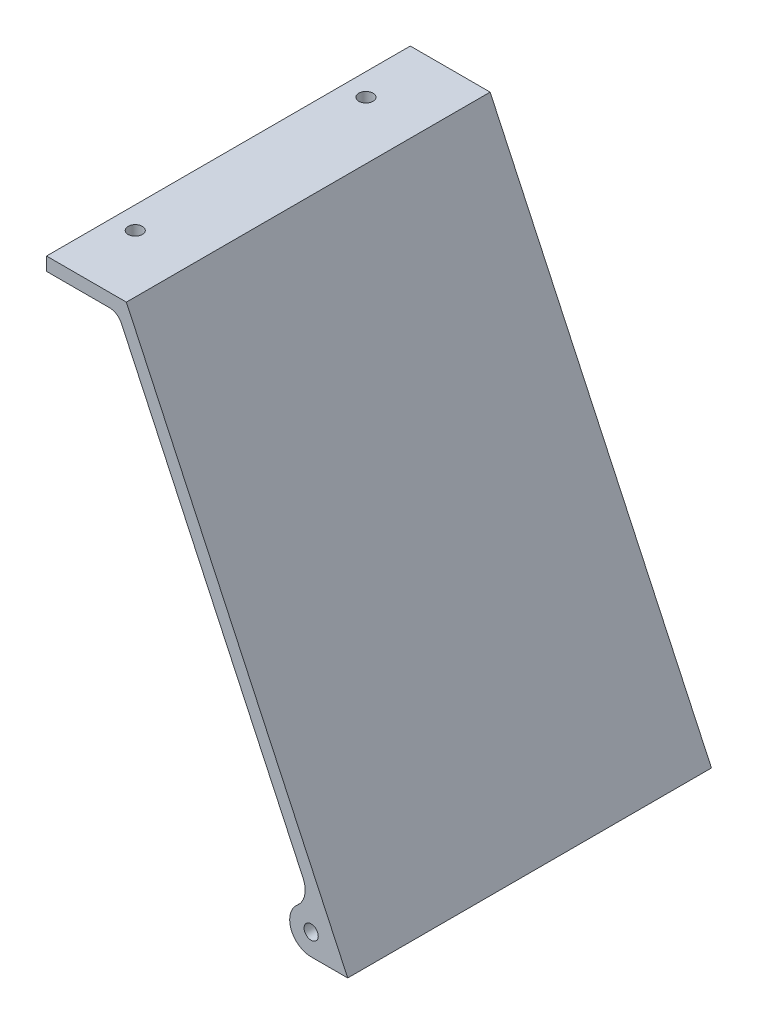
ISO-10303-21;
HEADER;
FILE_DESCRIPTION(('STEP AP214'),'2;1');
FILE_NAME('part.step','',(''),(''),'','','');
FILE_SCHEMA(('AUTOMOTIVE_DESIGN { 1 0 10303 214 1 1 1 1 }'));
ENDSEC;
DATA;
#1=APPLICATION_CONTEXT('core data for automotive mechanical design processes');
#2=APPLICATION_PROTOCOL_DEFINITION('international standard','automotive_design',2000,#1);
#3=PRODUCT_CONTEXT('',#1,'mechanical');
#4=PRODUCT('Part','Part','',(#3));
#5=PRODUCT_RELATED_PRODUCT_CATEGORY('part','',(#4));
#6=PRODUCT_DEFINITION_FORMATION('','',#4);
#7=PRODUCT_DEFINITION_CONTEXT('part definition',#1,'design');
#8=PRODUCT_DEFINITION('design','',#6,#7);
#9=PRODUCT_DEFINITION_SHAPE('','',#8);
#10=(LENGTH_UNIT() NAMED_UNIT(*) SI_UNIT(.MILLI.,.METRE.));
#11=(NAMED_UNIT(*) PLANE_ANGLE_UNIT() SI_UNIT($,.RADIAN.));
#12=(NAMED_UNIT(*) SI_UNIT($,.STERADIAN.) SOLID_ANGLE_UNIT());
#13=UNCERTAINTY_MEASURE_WITH_UNIT(LENGTH_MEASURE(1.E-05),#10,'distance_accuracy_value','');
#14=(GEOMETRIC_REPRESENTATION_CONTEXT(3) GLOBAL_UNCERTAINTY_ASSIGNED_CONTEXT((#13)) GLOBAL_UNIT_ASSIGNED_CONTEXT((#10,
#11,#12)) REPRESENTATION_CONTEXT('',''));
#15=CARTESIAN_POINT('',(0.,0.,0.));
#16=DIRECTION('',(0.,0.,1.));
#17=DIRECTION('',(1.,0.,0.));
#18=AXIS2_PLACEMENT_3D('',#15,#16,#17);
#19=CARTESIAN_POINT('',(25.7263298512666,-61.5435669274197,82.));
#20=DIRECTION('',(0.90630778703665,0.422618261740698,0.));
#21=DIRECTION('',(-0.422618261740698,0.906307787036651,0.));
#22=AXIS2_PLACEMENT_3D('',#19,#20,#21);
#23=PLANE('',#22);
#24=DIRECTION('',(0.422618261740698,-0.906307787036651,0.));
#25=VECTOR('',#24,1.);
#26=CARTESIAN_POINT('',(23.7563844825598,-57.3190054512023,5.));
#27=LINE('',#26,#25);
#28=CARTESIAN_POINT('',(23.7563844825598,-57.3190054512023,5.));
#29=VERTEX_POINT('',#28);
#30=CARTESIAN_POINT('',(30.5075500442898,-71.7969267198381,5.));
#31=VERTEX_POINT('',#30);
#32=EDGE_CURVE('E142',#29,#31,#27,.T.);
#33=ORIENTED_EDGE('',*,*,#32,.T.);
#34=DIRECTION('',(0.,0.,1.));
#35=VECTOR('',#34,1.);
#36=CARTESIAN_POINT('',(30.5075500442898,-71.7969267198381,0.));
#37=LINE('',#36,#35);
#38=CARTESIAN_POINT('',(30.5075500442898,-71.7969267198381,77.));
#39=VERTEX_POINT('',#38);
#40=EDGE_CURVE('E131',#31,#39,#37,.T.);
#41=ORIENTED_EDGE('',*,*,#40,.T.);
#42=DIRECTION('',(-0.422618261740698,0.906307787036651,0.));
#43=VECTOR('',#42,1.);
#44=CARTESIAN_POINT('',(23.7563844825598,-57.3190054512023,77.));
#45=LINE('',#44,#43);
#46=CARTESIAN_POINT('',(23.7563844825598,-57.3190054512023,77.));
#47=VERTEX_POINT('',#46);
#48=EDGE_CURVE('E237',#39,#47,#45,.T.);
#49=ORIENTED_EDGE('',*,*,#48,.T.);
#50=DIRECTION('',(0.,0.,1.));
#51=VECTOR('',#50,1.);
#52=CARTESIAN_POINT('',(23.7563844825598,-57.3190054512023,77.));
#53=LINE('',#52,#51);
#54=CARTESIAN_POINT('',(23.7563844825598,-57.3190054512023,82.));
#55=VERTEX_POINT('',#54);
#56=EDGE_CURVE('E236',#47,#55,#53,.T.);
#57=ORIENTED_EDGE('',*,*,#56,.T.);
#58=DIRECTION('',(0.422618261740698,-0.906307787036651,0.));
#59=VECTOR('',#58,1.);
#60=CARTESIAN_POINT('',(-17.9884464038298,32.2030732801619,82.));
#61=LINE('',#60,#59);
#62=CARTESIAN_POINT('',(-17.1807338251423,30.470928065384,82.));
#63=VERTEX_POINT('',#62);
#64=EDGE_CURVE('E185',#63,#55,#61,.T.);
#65=ORIENTED_EDGE('',*,*,#64,.F.);
#66=DIRECTION('',(0.,0.,-1.));
#67=VECTOR('',#66,1.);
#68=CARTESIAN_POINT('',(-17.1807338251424,30.470928065384,0.));
#69=LINE('',#68,#67);
#70=CARTESIAN_POINT('',(-17.1807338251424,30.470928065384,0.));
#71=VERTEX_POINT('',#70);
#72=EDGE_CURVE('E211',#63,#71,#69,.T.);
#73=ORIENTED_EDGE('',*,*,#72,.T.);
#74=DIRECTION('',(0.422618261740698,-0.906307787036651,0.));
#75=VECTOR('',#74,1.);
#76=CARTESIAN_POINT('',(25.7263298512666,-61.5435669274197,0.));
#77=LINE('',#76,#75);
#78=CARTESIAN_POINT('',(23.7563844825598,-57.3190054512023,0.));
#79=VERTEX_POINT('',#78);
#80=EDGE_CURVE('E57',#71,#79,#77,.T.);
#81=ORIENTED_EDGE('',*,*,#80,.T.);
#82=DIRECTION('',(0.,0.,-1.));
#83=VECTOR('',#82,1.);
#84=CARTESIAN_POINT('',(23.7563844825598,-57.3190054512023,5.));
#85=LINE('',#84,#83);
#86=EDGE_CURVE('E52',#29,#79,#85,.T.);
#87=ORIENTED_EDGE('',*,*,#86,.F.);
#88=EDGE_LOOP('',(#33,#41,#49,#57,#65,#73,#81,#87));
#89=FACE_BOUND('',#88,.T.);
#90=ADVANCED_FACE('F37',(#89),#23,.F.);
#91=CARTESIAN_POINT('',(-34.0772356214073,35.2030732801618,82.));
#92=DIRECTION('',(1.,0.,0.));
#93=DIRECTION('',(0.,0.,-1.));
#94=AXIS2_PLACEMENT_3D('',#91,#92,#93);
#95=PLANE('',#94);
#96=DIRECTION('',(0.,-1.,0.));
#97=VECTOR('',#96,1.);
#98=CARTESIAN_POINT('',(-34.0772356214073,35.2030732801618,0.));
#99=LINE('',#98,#97);
#100=CARTESIAN_POINT('',(-34.0772356214073,35.2030732801618,0.));
#101=VERTEX_POINT('',#100);
#102=CARTESIAN_POINT('',(-34.0772356214073,32.2030732801619,0.));
#103=VERTEX_POINT('',#102);
#104=EDGE_CURVE('E193',#101,#103,#99,.T.);
#105=ORIENTED_EDGE('',*,*,#104,.T.);
#106=DIRECTION('',(0.,0.,-1.));
#107=VECTOR('',#106,1.);
#108=CARTESIAN_POINT('',(-34.0772356214073,32.2030732801619,82.));
#109=LINE('',#108,#107);
#110=CARTESIAN_POINT('',(-34.0772356214073,32.2030732801619,82.));
#111=VERTEX_POINT('',#110);
#112=EDGE_CURVE('E208',#111,#103,#109,.T.);
#113=ORIENTED_EDGE('',*,*,#112,.F.);
#114=DIRECTION('',(0.,-1.,0.));
#115=VECTOR('',#114,1.);
#116=CARTESIAN_POINT('',(-34.0772356214073,35.2030732801618,82.));
#117=LINE('',#116,#115);
#118=CARTESIAN_POINT('',(-34.0772356214073,35.2030732801618,82.));
#119=VERTEX_POINT('',#118);
#120=EDGE_CURVE('E178',#119,#111,#117,.T.);
#121=ORIENTED_EDGE('',*,*,#120,.F.);
#122=DIRECTION('',(0.,0.,-1.));
#123=VECTOR('',#122,1.);
#124=CARTESIAN_POINT('',(-34.0772356214073,35.2030732801618,82.));
#125=LINE('',#124,#123);
#126=EDGE_CURVE('E192',#119,#101,#125,.T.);
#127=ORIENTED_EDGE('',*,*,#126,.T.);
#128=EDGE_LOOP('',(#105,#113,#121,#127));
#129=FACE_BOUND('',#128,.T.);
#130=ADVANCED_FACE('F310',(#129),#95,.F.);
#131=CARTESIAN_POINT('',(-34.0772356214073,32.2030732801619,82.));
#132=DIRECTION('',(0.,1.,0.));
#133=DIRECTION('',(0.,0.,1.));
#134=AXIS2_PLACEMENT_3D('',#131,#132,#133);
#135=PLANE('',#134);
#136=CARTESIAN_POINT('',(-29.0772356214073,32.2030732801619,15.));
#137=DIRECTION('',(0.,-1.,0.));
#138=DIRECTION('',(0.,0.,1.));
#139=AXIS2_PLACEMENT_3D('',#136,#137,#138);
#140=CIRCLE('',#139,1.6);
#141=CARTESIAN_POINT('',(-29.0772356214073,32.2030732801619,16.6));
#142=VERTEX_POINT('',#141);
#143=EDGE_CURVE('E167',#142,#142,#140,.T.);
#144=ORIENTED_EDGE('',*,*,#143,.F.);
#145=EDGE_LOOP('',(#144));
#146=FACE_BOUND('',#145,.T.);
#147=CARTESIAN_POINT('',(-29.0772356214073,32.2030732801619,67.));
#148=DIRECTION('',(0.,-1.,0.));
#149=DIRECTION('',(0.,0.,-1.));
#150=AXIS2_PLACEMENT_3D('',#147,#148,#149);
#151=CIRCLE('',#150,1.60000000000001);
#152=CARTESIAN_POINT('',(-29.0772356214073,32.2030732801619,65.4));
#153=VERTEX_POINT('',#152);
#154=EDGE_CURVE('E174',#153,#153,#151,.T.);
#155=ORIENTED_EDGE('',*,*,#154,.F.);
#156=EDGE_LOOP('',(#155));
#157=FACE_BOUND('',#156,.T.);
#158=DIRECTION('',(1.,0.,0.));
#159=VECTOR('',#158,1.);
#160=CARTESIAN_POINT('',(-34.0772356214073,32.2030732801619,0.));
#161=LINE('',#160,#159);
#162=CARTESIAN_POINT('',(-19.8996571862523,32.2030732801619,0.));
#163=VERTEX_POINT('',#162);
#164=EDGE_CURVE('E196',#103,#163,#161,.T.);
#165=ORIENTED_EDGE('',*,*,#164,.T.);
#166=DIRECTION('',(0.,0.,-1.));
#167=VECTOR('',#166,1.);
#168=CARTESIAN_POINT('',(-19.8996571862523,32.2030732801619,82.));
#169=LINE('',#168,#167);
#170=CARTESIAN_POINT('',(-19.8996571862523,32.2030732801619,82.));
#171=VERTEX_POINT('',#170);
#172=EDGE_CURVE('E217',#163,#171,#169,.F.);
#173=ORIENTED_EDGE('',*,*,#172,.T.);
#174=DIRECTION('',(1.,0.,0.));
#175=VECTOR('',#174,1.);
#176=CARTESIAN_POINT('',(-34.0772356214073,32.2030732801619,82.));
#177=LINE('',#176,#175);
#178=EDGE_CURVE('E181',#111,#171,#177,.T.);
#179=ORIENTED_EDGE('',*,*,#178,.F.);
#180=ORIENTED_EDGE('',*,*,#112,.T.);
#181=EDGE_LOOP('',(#165,#173,#179,#180));
#182=FACE_BOUND('',#181,.T.);
#183=ADVANCED_FACE('F227',(#146,#157,#182),#135,.F.);
#184=CARTESIAN_POINT('',(-16.0772356214073,35.2030732801618,82.));
#185=DIRECTION('',(-0.906307787036651,-0.422618261740698,0.));
#186=DIRECTION('',(0.422618261740698,-0.906307787036651,0.));
#187=AXIS2_PLACEMENT_3D('',#184,#185,#186);
#188=PLANE('',#187);
#189=DIRECTION('',(-0.422618261740698,0.906307787036651,0.));
#190=VECTOR('',#189,1.);
#191=CARTESIAN_POINT('',(-16.0772356214073,35.2030732801618,82.));
#192=LINE('',#191,#190);
#193=CARTESIAN_POINT('',(33.8176838011773,-71.7969267198381,82.));
#194=VERTEX_POINT('',#193);
#195=CARTESIAN_POINT('',(-16.0772356214073,35.2030732801618,82.));
#196=VERTEX_POINT('',#195);
#197=EDGE_CURVE('E188',#194,#196,#192,.T.);
#198=ORIENTED_EDGE('',*,*,#197,.F.);
#199=DIRECTION('',(0.,0.,-1.));
#200=VECTOR('',#199,1.);
#201=CARTESIAN_POINT('',(33.8176838011773,-71.7969267198381,82.));
#202=LINE('',#201,#200);
#203=CARTESIAN_POINT('',(33.8176838011773,-71.7969267198381,0.));
#204=VERTEX_POINT('',#203);
#205=EDGE_CURVE('E140',#194,#204,#202,.T.);
#206=ORIENTED_EDGE('',*,*,#205,.T.);
#207=DIRECTION('',(-0.422618261740698,0.906307787036651,0.));
#208=VECTOR('',#207,1.);
#209=CARTESIAN_POINT('',(-16.0772356214073,35.2030732801618,0.));
#210=LINE('',#209,#208);
#211=CARTESIAN_POINT('',(-16.0772356214073,35.2030732801618,0.));
#212=VERTEX_POINT('',#211);
#213=EDGE_CURVE('E200',#204,#212,#210,.T.);
#214=ORIENTED_EDGE('',*,*,#213,.T.);
#215=DIRECTION('',(0.,0.,-1.));
#216=VECTOR('',#215,1.);
#217=CARTESIAN_POINT('',(-16.0772356214073,35.2030732801618,82.));
#218=LINE('',#217,#216);
#219=EDGE_CURVE('E205',#196,#212,#218,.T.);
#220=ORIENTED_EDGE('',*,*,#219,.F.);
#221=EDGE_LOOP('',(#198,#206,#214,#220));
#222=FACE_BOUND('',#221,.T.);
#223=ADVANCED_FACE('F266',(#222),#188,.F.);
#224=CARTESIAN_POINT('',(-34.0772356214073,35.2030732801618,82.));
#225=DIRECTION('',(0.,-1.,0.));
#226=DIRECTION('',(0.,0.,-1.));
#227=AXIS2_PLACEMENT_3D('',#224,#225,#226);
#228=PLANE('',#227);
#229=CARTESIAN_POINT('',(-29.0772356214073,35.2030732801618,15.));
#230=DIRECTION('',(0.,-1.,0.));
#231=DIRECTION('',(0.,0.,-1.));
#232=AXIS2_PLACEMENT_3D('',#229,#230,#231);
#233=CIRCLE('',#232,1.6);
#234=CARTESIAN_POINT('',(-29.0772356214073,35.2030732801618,13.4));
#235=VERTEX_POINT('',#234);
#236=EDGE_CURVE('E173',#235,#235,#233,.T.);
#237=ORIENTED_EDGE('',*,*,#236,.T.);
#238=EDGE_LOOP('',(#237));
#239=FACE_BOUND('',#238,.T.);
#240=CARTESIAN_POINT('',(-29.0772356214073,35.2030732801618,67.));
#241=DIRECTION('',(0.,-1.,0.));
#242=DIRECTION('',(0.,0.,-1.));
#243=AXIS2_PLACEMENT_3D('',#240,#241,#242);
#244=CIRCLE('',#243,1.60000000000001);
#245=CARTESIAN_POINT('',(-29.0772356214073,35.2030732801618,65.4));
#246=VERTEX_POINT('',#245);
#247=EDGE_CURVE('E177',#246,#246,#244,.T.);
#248=ORIENTED_EDGE('',*,*,#247,.T.);
#249=EDGE_LOOP('',(#248));
#250=FACE_BOUND('',#249,.T.);
#251=DIRECTION('',(-1.,0.,0.));
#252=VECTOR('',#251,1.);
#253=CARTESIAN_POINT('',(-34.0772356214073,35.2030732801618,0.));
#254=LINE('',#253,#252);
#255=EDGE_CURVE('E182',#212,#101,#254,.T.);
#256=ORIENTED_EDGE('',*,*,#255,.T.);
#257=ORIENTED_EDGE('',*,*,#126,.F.);
#258=DIRECTION('',(-1.,0.,0.));
#259=VECTOR('',#258,1.);
#260=CARTESIAN_POINT('',(-34.0772356214073,35.2030732801618,82.));
#261=LINE('',#260,#259);
#262=EDGE_CURVE('E190',#196,#119,#261,.T.);
#263=ORIENTED_EDGE('',*,*,#262,.F.);
#264=ORIENTED_EDGE('',*,*,#219,.T.);
#265=EDGE_LOOP('',(#256,#257,#263,#264));
#266=FACE_BOUND('',#265,.T.);
#267=ADVANCED_FACE('F269',(#239,#250,#266),#228,.F.);
#268=CARTESIAN_POINT('',(0.,0.,82.));
#269=DIRECTION('',(0.,0.,1.));
#270=DIRECTION('',(1.,0.,0.));
#271=AXIS2_PLACEMENT_3D('',#268,#269,#270);
#272=PLANE('',#271);
#273=DIRECTION('',(1.,0.,0.));
#274=VECTOR('',#273,1.);
#275=CARTESIAN_POINT('',(25.5797174385931,-71.7969267198381,82.));
#276=LINE('',#275,#274);
#277=CARTESIAN_POINT('',(25.5797174385931,-71.7969267198381,82.));
#278=VERTEX_POINT('',#277);
#279=EDGE_CURVE('E249',#278,#194,#276,.T.);
#280=ORIENTED_EDGE('',*,*,#279,.T.);
#281=ORIENTED_EDGE('',*,*,#197,.T.);
#282=ORIENTED_EDGE('',*,*,#262,.T.);
#283=ORIENTED_EDGE('',*,*,#120,.T.);
#284=ORIENTED_EDGE('',*,*,#178,.T.);
#285=CARTESIAN_POINT('',(-19.8996571862523,29.2030732801619,82.));
#286=DIRECTION('',(0.,0.,1.));
#287=DIRECTION('',(1.,0.,0.));
#288=AXIS2_PLACEMENT_3D('',#285,#286,#287);
#289=CIRCLE('',#288,3.);
#290=EDGE_CURVE('E11',#171,#63,#289,.F.);
#291=ORIENTED_EDGE('',*,*,#290,.T.);
#292=ORIENTED_EDGE('',*,*,#64,.T.);
#293=CARTESIAN_POINT('',(19.2248455473765,-59.4320967599058,82.));
#294=DIRECTION('',(0.,0.,-1.));
#295=DIRECTION('',(1.,0.,0.));
#296=AXIS2_PLACEMENT_3D('',#293,#294,#295);
#297=CIRCLE('',#296,5.);
#298=CARTESIAN_POINT('',(22.4522296107558,-63.2509960918397,82.));
#299=VERTEX_POINT('',#298);
#300=EDGE_CURVE('E284',#55,#299,#297,.T.);
#301=ORIENTED_EDGE('',*,*,#300,.T.);
#302=CARTESIAN_POINT('',(25.5797174385931,-66.9516901963568,82.));
#303=DIRECTION('',(0.,0.,1.));
#304=DIRECTION('',(1.,0.,0.));
#305=AXIS2_PLACEMENT_3D('',#302,#303,#304);
#306=CIRCLE('',#305,4.84523652348138);
#307=EDGE_CURVE('E275',#299,#278,#306,.T.);
#308=ORIENTED_EDGE('',*,*,#307,.T.);
#309=EDGE_LOOP('',(#280,#281,#282,#283,#284,#291,#292,#301,#308));
#310=FACE_BOUND('',#309,.T.);
#311=CARTESIAN_POINT('',(25.5797174385931,-66.9516901963568,82.));
#312=DIRECTION('',(0.,0.,1.));
#313=DIRECTION('',(1.,0.,0.));
#314=AXIS2_PLACEMENT_3D('',#311,#312,#313);
#315=CIRCLE('',#314,1.60000000000001);
#316=CARTESIAN_POINT('',(27.1797174385931,-66.9516901963568,82.));
#317=VERTEX_POINT('',#316);
#318=EDGE_CURVE('E277',#317,#317,#315,.T.);
#319=ORIENTED_EDGE('',*,*,#318,.F.);
#320=EDGE_LOOP('',(#319));
#321=FACE_BOUND('',#320,.T.);
#322=ADVANCED_FACE('F232',(#310,#321),#272,.T.);
#323=CARTESIAN_POINT('',(0.,0.,0.));
#324=DIRECTION('',(0.,0.,1.));
#325=DIRECTION('',(1.,0.,0.));
#326=AXIS2_PLACEMENT_3D('',#323,#324,#325);
#327=PLANE('',#326);
#328=ORIENTED_EDGE('',*,*,#213,.F.);
#329=DIRECTION('',(-1.,0.,0.));
#330=VECTOR('',#329,1.);
#331=CARTESIAN_POINT('',(25.5797174385931,-71.7969267198381,0.));
#332=LINE('',#331,#330);
#333=CARTESIAN_POINT('',(25.5797174385931,-71.7969267198381,0.));
#334=VERTEX_POINT('',#333);
#335=EDGE_CURVE('E158',#204,#334,#332,.T.);
#336=ORIENTED_EDGE('',*,*,#335,.T.);
#337=CARTESIAN_POINT('',(25.5797174385931,-66.9516901963568,0.));
#338=DIRECTION('',(0.,0.,-1.));
#339=DIRECTION('',(-1.,0.,0.));
#340=AXIS2_PLACEMENT_3D('',#337,#338,#339);
#341=CIRCLE('',#340,4.84523652348137);
#342=CARTESIAN_POINT('',(22.4522296107558,-63.2509960918397,0.));
#343=VERTEX_POINT('',#342);
#344=EDGE_CURVE('E162',#334,#343,#341,.T.);
#345=ORIENTED_EDGE('',*,*,#344,.T.);
#346=CARTESIAN_POINT('',(19.2248455473765,-59.4320967599058,0.));
#347=DIRECTION('',(0.,0.,1.));
#348=DIRECTION('',(1.,0.,0.));
#349=AXIS2_PLACEMENT_3D('',#346,#347,#348);
#350=CIRCLE('',#349,5.);
#351=EDGE_CURVE('E155',#343,#79,#350,.T.);
#352=ORIENTED_EDGE('',*,*,#351,.T.);
#353=ORIENTED_EDGE('',*,*,#80,.F.);
#354=CARTESIAN_POINT('',(-19.8996571862523,29.2030732801619,0.));
#355=DIRECTION('',(0.,0.,1.));
#356=DIRECTION('',(1.,0.,0.));
#357=AXIS2_PLACEMENT_3D('',#354,#355,#356);
#358=CIRCLE('',#357,3.);
#359=EDGE_CURVE('E45',#71,#163,#358,.T.);
#360=ORIENTED_EDGE('',*,*,#359,.T.);
#361=ORIENTED_EDGE('',*,*,#164,.F.);
#362=ORIENTED_EDGE('',*,*,#104,.F.);
#363=ORIENTED_EDGE('',*,*,#255,.F.);
#364=EDGE_LOOP('',(#328,#336,#345,#352,#353,#360,#361,#362,#363));
#365=FACE_BOUND('',#364,.T.);
#366=CARTESIAN_POINT('',(25.5797174385931,-66.9516901963568,0.));
#367=DIRECTION('',(0.,0.,-1.));
#368=DIRECTION('',(-1.,0.,0.));
#369=AXIS2_PLACEMENT_3D('',#366,#367,#368);
#370=CIRCLE('',#369,1.60000000000001);
#371=CARTESIAN_POINT('',(23.9797174385931,-66.9516901963568,0.));
#372=VERTEX_POINT('',#371);
#373=EDGE_CURVE('E241',#372,#372,#370,.T.);
#374=ORIENTED_EDGE('',*,*,#373,.F.);
#375=EDGE_LOOP('',(#374));
#376=FACE_BOUND('',#375,.T.);
#377=ADVANCED_FACE('F220',(#365,#376),#327,.F.);
#378=CARTESIAN_POINT('',(-29.0772356214073,42.2030732801619,67.));
#379=DIRECTION('',(0.,-1.,0.));
#380=DIRECTION('',(0.,0.,-1.));
#381=AXIS2_PLACEMENT_3D('',#378,#379,#380);
#382=CYLINDRICAL_SURFACE('',#381,1.60000000000001);
#383=ORIENTED_EDGE('',*,*,#154,.T.);
#384=EDGE_LOOP('',(#383));
#385=FACE_BOUND('',#384,.T.);
#386=ORIENTED_EDGE('',*,*,#247,.F.);
#387=EDGE_LOOP('',(#386));
#388=FACE_BOUND('',#387,.T.);
#389=ADVANCED_FACE('F328',(#385,#388),#382,.F.);
#390=CARTESIAN_POINT('',(-29.0772356214073,42.2030732801619,15.));
#391=DIRECTION('',(0.,-1.,0.));
#392=DIRECTION('',(0.,0.,-1.));
#393=AXIS2_PLACEMENT_3D('',#390,#391,#392);
#394=CYLINDRICAL_SURFACE('',#393,1.6);
#395=ORIENTED_EDGE('',*,*,#143,.T.);
#396=EDGE_LOOP('',(#395));
#397=FACE_BOUND('',#396,.T.);
#398=ORIENTED_EDGE('',*,*,#236,.F.);
#399=EDGE_LOOP('',(#398));
#400=FACE_BOUND('',#399,.T.);
#401=ADVANCED_FACE('F331',(#397,#400),#394,.F.);
#402=CARTESIAN_POINT('',(-19.8996571862523,29.2030732801619,82.));
#403=DIRECTION('',(0.,0.,1.));
#404=DIRECTION('',(1.,0.,0.));
#405=AXIS2_PLACEMENT_3D('',#402,#403,#404);
#406=CYLINDRICAL_SURFACE('',#405,3.);
#407=ORIENTED_EDGE('',*,*,#290,.F.);
#408=ORIENTED_EDGE('',*,*,#172,.F.);
#409=ORIENTED_EDGE('',*,*,#359,.F.);
#410=ORIENTED_EDGE('',*,*,#72,.F.);
#411=EDGE_LOOP('',(#407,#408,#409,#410));
#412=FACE_BOUND('',#411,.T.);
#413=ADVANCED_FACE('F39',(#412),#406,.F.);
#414=CARTESIAN_POINT('',(19.2248455473765,-59.4320967599058,5.));
#415=DIRECTION('',(0.,0.,-1.));
#416=DIRECTION('',(-1.,0.,0.));
#417=AXIS2_PLACEMENT_3D('',#414,#415,#416);
#418=CYLINDRICAL_SURFACE('',#417,5.);
#419=ORIENTED_EDGE('',*,*,#351,.F.);
#420=DIRECTION('',(0.,0.,-1.));
#421=VECTOR('',#420,1.);
#422=CARTESIAN_POINT('',(22.4522296107558,-63.2509960918397,5.));
#423=LINE('',#422,#421);
#424=CARTESIAN_POINT('',(22.4522296107558,-63.2509960918397,5.));
#425=VERTEX_POINT('',#424);
#426=EDGE_CURVE('E165',#425,#343,#423,.T.);
#427=ORIENTED_EDGE('',*,*,#426,.F.);
#428=CARTESIAN_POINT('',(19.2248455473765,-59.4320967599058,5.));
#429=DIRECTION('',(0.,0.,1.));
#430=DIRECTION('',(1.,0.,0.));
#431=AXIS2_PLACEMENT_3D('',#428,#429,#430);
#432=CIRCLE('',#431,5.);
#433=EDGE_CURVE('E146',#425,#29,#432,.T.);
#434=ORIENTED_EDGE('',*,*,#433,.T.);
#435=ORIENTED_EDGE('',*,*,#86,.T.);
#436=EDGE_LOOP('',(#419,#427,#434,#435));
#437=FACE_BOUND('',#436,.T.);
#438=ADVANCED_FACE('F256',(#437),#418,.F.);
#439=CARTESIAN_POINT('',(25.5797174385931,-66.9516901963568,5.));
#440=DIRECTION('',(0.,0.,-1.));
#441=DIRECTION('',(-1.,0.,0.));
#442=AXIS2_PLACEMENT_3D('',#439,#440,#441);
#443=CYLINDRICAL_SURFACE('',#442,4.84523652348137);
#444=ORIENTED_EDGE('',*,*,#344,.F.);
#445=DIRECTION('',(0.,0.,-1.));
#446=VECTOR('',#445,1.);
#447=CARTESIAN_POINT('',(25.5797174385931,-71.7969267198381,5.));
#448=LINE('',#447,#446);
#449=CARTESIAN_POINT('',(25.5797174385931,-71.7969267198381,5.));
#450=VERTEX_POINT('',#449);
#451=EDGE_CURVE('E168',#450,#334,#448,.T.);
#452=ORIENTED_EDGE('',*,*,#451,.F.);
#453=CARTESIAN_POINT('',(25.5797174385931,-66.9516901963568,5.));
#454=DIRECTION('',(0.,0.,-1.));
#455=DIRECTION('',(-1.,0.,0.));
#456=AXIS2_PLACEMENT_3D('',#453,#454,#455);
#457=CIRCLE('',#456,4.84523652348137);
#458=EDGE_CURVE('E150',#450,#425,#457,.T.);
#459=ORIENTED_EDGE('',*,*,#458,.T.);
#460=ORIENTED_EDGE('',*,*,#426,.T.);
#461=EDGE_LOOP('',(#444,#452,#459,#460));
#462=FACE_BOUND('',#461,.T.);
#463=ADVANCED_FACE('F259',(#462),#443,.T.);
#464=CARTESIAN_POINT('',(25.5797174385931,-71.7969267198381,5.));
#465=DIRECTION('',(0.,-1.,0.));
#466=DIRECTION('',(0.,0.,-1.));
#467=AXIS2_PLACEMENT_3D('',#464,#465,#466);
#468=PLANE('',#467);
#469=ORIENTED_EDGE('',*,*,#335,.F.);
#470=ORIENTED_EDGE('',*,*,#205,.F.);
#471=ORIENTED_EDGE('',*,*,#279,.F.);
#472=DIRECTION('',(0.,0.,1.));
#473=VECTOR('',#472,1.);
#474=CARTESIAN_POINT('',(25.5797174385931,-71.7969267198381,77.));
#475=LINE('',#474,#473);
#476=CARTESIAN_POINT('',(25.5797174385931,-71.7969267198381,77.));
#477=VERTEX_POINT('',#476);
#478=EDGE_CURVE('E242',#477,#278,#475,.T.);
#479=ORIENTED_EDGE('',*,*,#478,.F.);
#480=DIRECTION('',(1.,0.,0.));
#481=VECTOR('',#480,1.);
#482=CARTESIAN_POINT('',(25.5797174385931,-71.7969267198381,77.));
#483=LINE('',#482,#481);
#484=EDGE_CURVE('E137',#477,#39,#483,.T.);
#485=ORIENTED_EDGE('',*,*,#484,.T.);
#486=ORIENTED_EDGE('',*,*,#40,.F.);
#487=DIRECTION('',(-1.,0.,0.));
#488=VECTOR('',#487,1.);
#489=CARTESIAN_POINT('',(25.5797174385931,-71.7969267198381,5.));
#490=LINE('',#489,#488);
#491=EDGE_CURVE('E134',#31,#450,#490,.T.);
#492=ORIENTED_EDGE('',*,*,#491,.T.);
#493=ORIENTED_EDGE('',*,*,#451,.T.);
#494=EDGE_LOOP('',(#469,#470,#471,#479,#485,#486,#492,#493));
#495=FACE_BOUND('',#494,.T.);
#496=ADVANCED_FACE('F132',(#495),#468,.T.);
#497=CARTESIAN_POINT('',(19.2248455473765,-59.4320967599058,5.));
#498=DIRECTION('',(0.,0.,1.));
#499=DIRECTION('',(1.,0.,0.));
#500=AXIS2_PLACEMENT_3D('',#497,#498,#499);
#501=PLANE('',#500);
#502=CARTESIAN_POINT('',(25.5797174385931,-66.9516901963568,5.));
#503=DIRECTION('',(0.,0.,-1.));
#504=DIRECTION('',(-1.,0.,0.));
#505=AXIS2_PLACEMENT_3D('',#502,#503,#504);
#506=CIRCLE('',#505,1.60000000000001);
#507=CARTESIAN_POINT('',(23.9797174385931,-66.9516901963568,5.));
#508=VERTEX_POINT('',#507);
#509=EDGE_CURVE('E159',#508,#508,#506,.T.);
#510=ORIENTED_EDGE('',*,*,#509,.T.);
#511=EDGE_LOOP('',(#510));
#512=FACE_BOUND('',#511,.T.);
#513=ORIENTED_EDGE('',*,*,#433,.F.);
#514=ORIENTED_EDGE('',*,*,#458,.F.);
#515=ORIENTED_EDGE('',*,*,#491,.F.);
#516=ORIENTED_EDGE('',*,*,#32,.F.);
#517=EDGE_LOOP('',(#513,#514,#515,#516));
#518=FACE_BOUND('',#517,.T.);
#519=ADVANCED_FACE('F148',(#512,#518),#501,.T.);
#520=CARTESIAN_POINT('',(25.5797174385931,-66.9516901963568,5.));
#521=DIRECTION('',(0.,0.,-1.));
#522=DIRECTION('',(-1.,0.,0.));
#523=AXIS2_PLACEMENT_3D('',#520,#521,#522);
#524=CYLINDRICAL_SURFACE('',#523,1.60000000000001);
#525=ORIENTED_EDGE('',*,*,#509,.F.);
#526=EDGE_LOOP('',(#525));
#527=FACE_BOUND('',#526,.T.);
#528=ORIENTED_EDGE('',*,*,#373,.T.);
#529=EDGE_LOOP('',(#528));
#530=FACE_BOUND('',#529,.T.);
#531=ADVANCED_FACE('F355',(#527,#530),#524,.F.);
#532=CARTESIAN_POINT('',(19.2248455473765,-59.4320967599058,77.));
#533=DIRECTION('',(0.,0.,1.));
#534=DIRECTION('',(1.,0.,0.));
#535=AXIS2_PLACEMENT_3D('',#532,#533,#534);
#536=CYLINDRICAL_SURFACE('',#535,5.);
#537=ORIENTED_EDGE('',*,*,#300,.F.);
#538=ORIENTED_EDGE('',*,*,#56,.F.);
#539=CARTESIAN_POINT('',(19.2248455473765,-59.4320967599058,77.));
#540=DIRECTION('',(0.,0.,-1.));
#541=DIRECTION('',(1.,0.,0.));
#542=AXIS2_PLACEMENT_3D('',#539,#540,#541);
#543=CIRCLE('',#542,5.);
#544=CARTESIAN_POINT('',(22.4522296107558,-63.2509960918397,77.));
#545=VERTEX_POINT('',#544);
#546=EDGE_CURVE('E276',#47,#545,#543,.T.);
#547=ORIENTED_EDGE('',*,*,#546,.T.);
#548=DIRECTION('',(0.,0.,1.));
#549=VECTOR('',#548,1.);
#550=CARTESIAN_POINT('',(22.4522296107558,-63.2509960918397,77.));
#551=LINE('',#550,#549);
#552=EDGE_CURVE('E246',#545,#299,#551,.T.);
#553=ORIENTED_EDGE('',*,*,#552,.T.);
#554=EDGE_LOOP('',(#537,#538,#547,#553));
#555=FACE_BOUND('',#554,.T.);
#556=ADVANCED_FACE('F292',(#555),#536,.F.);
#557=CARTESIAN_POINT('',(25.5797174385931,-66.9516901963568,77.));
#558=DIRECTION('',(0.,0.,1.));
#559=DIRECTION('',(1.,0.,0.));
#560=AXIS2_PLACEMENT_3D('',#557,#558,#559);
#561=CYLINDRICAL_SURFACE('',#560,4.84523652348138);
#562=ORIENTED_EDGE('',*,*,#307,.F.);
#563=ORIENTED_EDGE('',*,*,#552,.F.);
#564=CARTESIAN_POINT('',(25.5797174385931,-66.9516901963568,77.));
#565=DIRECTION('',(0.,0.,1.));
#566=DIRECTION('',(1.,0.,0.));
#567=AXIS2_PLACEMENT_3D('',#564,#565,#566);
#568=CIRCLE('',#567,4.84523652348138);
#569=EDGE_CURVE('E287',#545,#477,#568,.T.);
#570=ORIENTED_EDGE('',*,*,#569,.T.);
#571=ORIENTED_EDGE('',*,*,#478,.T.);
#572=EDGE_LOOP('',(#562,#563,#570,#571));
#573=FACE_BOUND('',#572,.T.);
#574=ADVANCED_FACE('F295',(#573),#561,.T.);
#575=CARTESIAN_POINT('',(19.2248455473765,-59.4320967599058,77.));
#576=DIRECTION('',(0.,0.,1.));
#577=DIRECTION('',(1.,0.,0.));
#578=AXIS2_PLACEMENT_3D('',#575,#576,#577);
#579=PLANE('',#578);
#580=CARTESIAN_POINT('',(25.5797174385931,-66.9516901963568,77.));
#581=DIRECTION('',(0.,0.,1.));
#582=DIRECTION('',(1.,0.,0.));
#583=AXIS2_PLACEMENT_3D('',#580,#581,#582);
#584=CIRCLE('',#583,1.60000000000001);
#585=CARTESIAN_POINT('',(27.1797174385931,-66.9516901963568,77.));
#586=VERTEX_POINT('',#585);
#587=EDGE_CURVE('E280',#586,#586,#584,.T.);
#588=ORIENTED_EDGE('',*,*,#587,.T.);
#589=EDGE_LOOP('',(#588));
#590=FACE_BOUND('',#589,.T.);
#591=ORIENTED_EDGE('',*,*,#546,.F.);
#592=ORIENTED_EDGE('',*,*,#48,.F.);
#593=ORIENTED_EDGE('',*,*,#484,.F.);
#594=ORIENTED_EDGE('',*,*,#569,.F.);
#595=EDGE_LOOP('',(#591,#592,#593,#594));
#596=FACE_BOUND('',#595,.T.);
#597=ADVANCED_FACE('F297',(#590,#596),#579,.F.);
#598=CARTESIAN_POINT('',(25.5797174385931,-66.9516901963568,77.));
#599=DIRECTION('',(0.,0.,1.));
#600=DIRECTION('',(1.,0.,0.));
#601=AXIS2_PLACEMENT_3D('',#598,#599,#600);
#602=CYLINDRICAL_SURFACE('',#601,1.60000000000001);
#603=ORIENTED_EDGE('',*,*,#587,.F.);
#604=EDGE_LOOP('',(#603));
#605=FACE_BOUND('',#604,.T.);
#606=ORIENTED_EDGE('',*,*,#318,.T.);
#607=EDGE_LOOP('',(#606));
#608=FACE_BOUND('',#607,.T.);
#609=ADVANCED_FACE('F299',(#605,#608),#602,.F.);
#610=CLOSED_SHELL('',(#90,#130,#183,#223,#267,#322,#377,#389,#401,#413,#438,#463,#496,#519,#531,
#556,#574,#597,#609));
#611=MANIFOLD_SOLID_BREP('B2',#610);
#612=ADVANCED_BREP_SHAPE_REPRESENTATION('',(#18,#611),#14);
#613=SHAPE_DEFINITION_REPRESENTATION(#9,#612);
ENDSEC;
END-ISO-10303-21;
